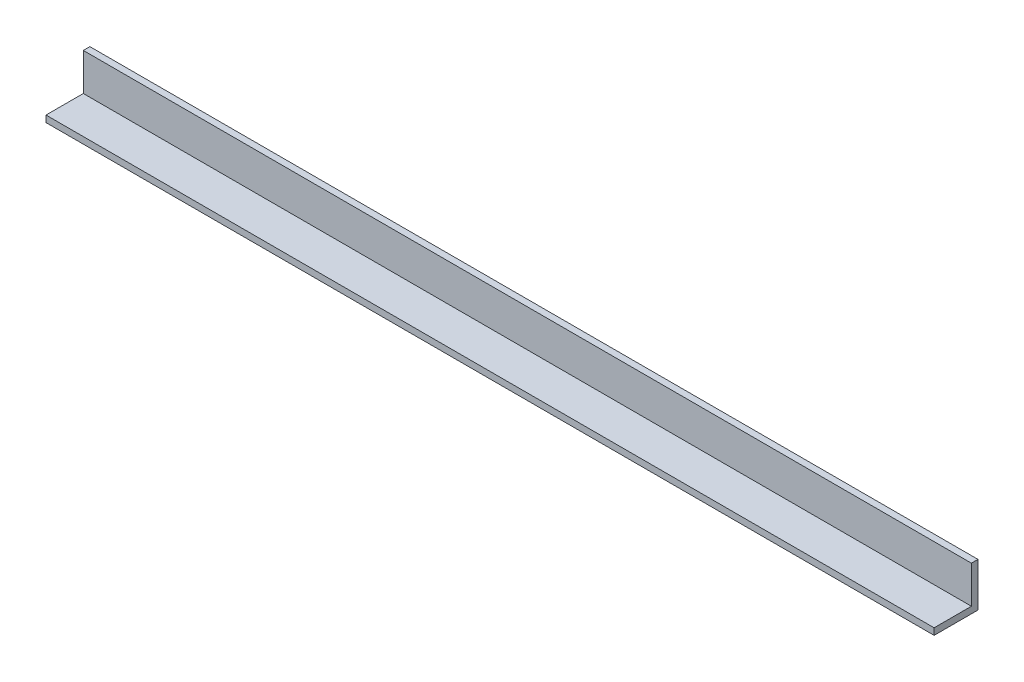
ISO-10303-21;
HEADER;
FILE_DESCRIPTION(('STEP AP214'),'2;1');
FILE_NAME('part.step','',(''),(''),'','','');
FILE_SCHEMA(('AUTOMOTIVE_DESIGN { 1 0 10303 214 1 1 1 1 }'));
ENDSEC;
DATA;
#1=APPLICATION_CONTEXT('core data for automotive mechanical design processes');
#2=APPLICATION_PROTOCOL_DEFINITION('international standard','automotive_design',2000,#1);
#3=PRODUCT_CONTEXT('',#1,'mechanical');
#4=PRODUCT('Part','Part','',(#3));
#5=PRODUCT_RELATED_PRODUCT_CATEGORY('part','',(#4));
#6=PRODUCT_DEFINITION_FORMATION('','',#4);
#7=PRODUCT_DEFINITION_CONTEXT('part definition',#1,'design');
#8=PRODUCT_DEFINITION('design','',#6,#7);
#9=PRODUCT_DEFINITION_SHAPE('','',#8);
#10=(LENGTH_UNIT() NAMED_UNIT(*) SI_UNIT(.MILLI.,.METRE.));
#11=(NAMED_UNIT(*) PLANE_ANGLE_UNIT() SI_UNIT($,.RADIAN.));
#12=(NAMED_UNIT(*) SI_UNIT($,.STERADIAN.) SOLID_ANGLE_UNIT());
#13=UNCERTAINTY_MEASURE_WITH_UNIT(LENGTH_MEASURE(1.E-05),#10,'distance_accuracy_value','');
#14=(GEOMETRIC_REPRESENTATION_CONTEXT(3) GLOBAL_UNCERTAINTY_ASSIGNED_CONTEXT((#13)) GLOBAL_UNIT_ASSIGNED_CONTEXT((#10,
#11,#12)) REPRESENTATION_CONTEXT('',''));
#15=CARTESIAN_POINT('',(0.,0.,0.));
#16=DIRECTION('',(0.,0.,1.));
#17=DIRECTION('',(1.,0.,0.));
#18=AXIS2_PLACEMENT_3D('',#15,#16,#17);
#19=CARTESIAN_POINT('',(0.,0.,80.));
#20=DIRECTION('',(1.,0.,0.));
#21=DIRECTION('',(0.,0.,-1.));
#22=AXIS2_PLACEMENT_3D('',#19,#20,#21);
#23=PLANE('',#22);
#24=DIRECTION('',(0.,0.,1.));
#25=VECTOR('',#24,1.);
#26=CARTESIAN_POINT('',(0.,12.,12.));
#27=LINE('',#26,#25);
#28=CARTESIAN_POINT('',(0.,12.,12.));
#29=VERTEX_POINT('',#28);
#30=CARTESIAN_POINT('',(0.,12.,80.));
#31=VERTEX_POINT('',#30);
#32=EDGE_CURVE('E46',#29,#31,#27,.T.);
#33=ORIENTED_EDGE('',*,*,#32,.F.);
#34=DIRECTION('',(0.,-1.,0.));
#35=VECTOR('',#34,1.);
#36=CARTESIAN_POINT('',(0.,80.,12.));
#37=LINE('',#36,#35);
#38=CARTESIAN_POINT('',(0.,80.,12.));
#39=VERTEX_POINT('',#38);
#40=EDGE_CURVE('E82',#39,#29,#37,.T.);
#41=ORIENTED_EDGE('',*,*,#40,.F.);
#42=DIRECTION('',(0.,0.,-1.));
#43=VECTOR('',#42,1.);
#44=CARTESIAN_POINT('',(0.,80.,80.));
#45=LINE('',#44,#43);
#46=CARTESIAN_POINT('',(0.,80.,0.));
#47=VERTEX_POINT('',#46);
#48=EDGE_CURVE('E75',#39,#47,#45,.T.);
#49=ORIENTED_EDGE('',*,*,#48,.T.);
#50=DIRECTION('',(0.,-1.,0.));
#51=VECTOR('',#50,1.);
#52=CARTESIAN_POINT('',(0.,0.,0.));
#53=LINE('',#52,#51);
#54=CARTESIAN_POINT('',(0.,0.,0.));
#55=VERTEX_POINT('',#54);
#56=EDGE_CURVE('E79',#47,#55,#53,.T.);
#57=ORIENTED_EDGE('',*,*,#56,.T.);
#58=DIRECTION('',(0.,0.,-1.));
#59=VECTOR('',#58,1.);
#60=CARTESIAN_POINT('',(0.,0.,80.));
#61=LINE('',#60,#59);
#62=CARTESIAN_POINT('',(0.,0.,80.));
#63=VERTEX_POINT('',#62);
#64=EDGE_CURVE('E11',#63,#55,#61,.T.);
#65=ORIENTED_EDGE('',*,*,#64,.F.);
#66=DIRECTION('',(0.,-1.,0.));
#67=VECTOR('',#66,1.);
#68=CARTESIAN_POINT('',(0.,0.,80.));
#69=LINE('',#68,#67);
#70=EDGE_CURVE('E95',#31,#63,#69,.T.);
#71=ORIENTED_EDGE('',*,*,#70,.F.);
#72=EDGE_LOOP('',(#33,#41,#49,#57,#65,#71));
#73=FACE_BOUND('',#72,.T.);
#74=ADVANCED_FACE('F32',(#73),#23,.F.);
#75=CARTESIAN_POINT('',(0.,0.,80.));
#76=DIRECTION('',(0.,1.,0.));
#77=DIRECTION('',(0.,0.,1.));
#78=AXIS2_PLACEMENT_3D('',#75,#76,#77);
#79=PLANE('',#78);
#80=DIRECTION('',(1.,0.,0.));
#81=VECTOR('',#80,1.);
#82=CARTESIAN_POINT('',(0.,0.,0.));
#83=LINE('',#82,#81);
#84=CARTESIAN_POINT('',(1619.,0.,0.));
#85=VERTEX_POINT('',#84);
#86=EDGE_CURVE('E99',#55,#85,#83,.T.);
#87=ORIENTED_EDGE('',*,*,#86,.T.);
#88=DIRECTION('',(0.,0.,-1.));
#89=VECTOR('',#88,1.);
#90=CARTESIAN_POINT('',(1619.,0.,80.));
#91=LINE('',#90,#89);
#92=CARTESIAN_POINT('',(1619.,0.,80.));
#93=VERTEX_POINT('',#92);
#94=EDGE_CURVE('E39',#93,#85,#91,.T.);
#95=ORIENTED_EDGE('',*,*,#94,.F.);
#96=DIRECTION('',(1.,0.,0.));
#97=VECTOR('',#96,1.);
#98=CARTESIAN_POINT('',(0.,0.,80.));
#99=LINE('',#98,#97);
#100=EDGE_CURVE('E55',#63,#93,#99,.T.);
#101=ORIENTED_EDGE('',*,*,#100,.F.);
#102=ORIENTED_EDGE('',*,*,#64,.T.);
#103=EDGE_LOOP('',(#87,#95,#101,#102));
#104=FACE_BOUND('',#103,.T.);
#105=ADVANCED_FACE('F116',(#104),#79,.F.);
#106=CARTESIAN_POINT('',(1619.,0.,80.));
#107=DIRECTION('',(-1.,0.,0.));
#108=DIRECTION('',(0.,0.,1.));
#109=AXIS2_PLACEMENT_3D('',#106,#107,#108);
#110=PLANE('',#109);
#111=DIRECTION('',(0.,0.,-1.));
#112=VECTOR('',#111,1.);
#113=CARTESIAN_POINT('',(1619.,80.,80.));
#114=LINE('',#113,#112);
#115=CARTESIAN_POINT('',(1619.,80.,12.));
#116=VERTEX_POINT('',#115);
#117=CARTESIAN_POINT('',(1619.,80.,0.));
#118=VERTEX_POINT('',#117);
#119=EDGE_CURVE('E85',#116,#118,#114,.T.);
#120=ORIENTED_EDGE('',*,*,#119,.F.);
#121=DIRECTION('',(0.,-1.,0.));
#122=VECTOR('',#121,1.);
#123=CARTESIAN_POINT('',(1619.,80.,12.));
#124=LINE('',#123,#122);
#125=CARTESIAN_POINT('',(1619.,12.,12.));
#126=VERTEX_POINT('',#125);
#127=EDGE_CURVE('E126',#116,#126,#124,.T.);
#128=ORIENTED_EDGE('',*,*,#127,.T.);
#129=DIRECTION('',(0.,0.,1.));
#130=VECTOR('',#129,1.);
#131=CARTESIAN_POINT('',(1619.,12.,12.));
#132=LINE('',#131,#130);
#133=CARTESIAN_POINT('',(1619.,12.,80.));
#134=VERTEX_POINT('',#133);
#135=EDGE_CURVE('E123',#126,#134,#132,.T.);
#136=ORIENTED_EDGE('',*,*,#135,.T.);
#137=DIRECTION('',(0.,1.,0.));
#138=VECTOR('',#137,1.);
#139=CARTESIAN_POINT('',(1619.,0.,80.));
#140=LINE('',#139,#138);
#141=EDGE_CURVE('E86',#93,#134,#140,.T.);
#142=ORIENTED_EDGE('',*,*,#141,.F.);
#143=ORIENTED_EDGE('',*,*,#94,.T.);
#144=DIRECTION('',(0.,1.,0.));
#145=VECTOR('',#144,1.);
#146=CARTESIAN_POINT('',(1619.,0.,0.));
#147=LINE('',#146,#145);
#148=EDGE_CURVE('E96',#85,#118,#147,.T.);
#149=ORIENTED_EDGE('',*,*,#148,.T.);
#150=EDGE_LOOP('',(#120,#128,#136,#142,#143,#149));
#151=FACE_BOUND('',#150,.T.);
#152=ADVANCED_FACE('F113',(#151),#110,.F.);
#153=CARTESIAN_POINT('',(0.,80.,80.));
#154=DIRECTION('',(0.,-1.,0.));
#155=DIRECTION('',(0.,0.,-1.));
#156=AXIS2_PLACEMENT_3D('',#153,#154,#155);
#157=PLANE('',#156);
#158=ORIENTED_EDGE('',*,*,#48,.F.);
#159=DIRECTION('',(-1.,0.,0.));
#160=VECTOR('',#159,1.);
#161=CARTESIAN_POINT('',(1619.,80.,12.));
#162=LINE('',#161,#160);
#163=EDGE_CURVE('E100',#116,#39,#162,.T.);
#164=ORIENTED_EDGE('',*,*,#163,.F.);
#165=ORIENTED_EDGE('',*,*,#119,.T.);
#166=DIRECTION('',(-1.,0.,0.));
#167=VECTOR('',#166,1.);
#168=CARTESIAN_POINT('',(0.,80.,0.));
#169=LINE('',#168,#167);
#170=EDGE_CURVE('E89',#118,#47,#169,.T.);
#171=ORIENTED_EDGE('',*,*,#170,.T.);
#172=EDGE_LOOP('',(#158,#164,#165,#171));
#173=FACE_BOUND('',#172,.T.);
#174=ADVANCED_FACE('F90',(#173),#157,.F.);
#175=CARTESIAN_POINT('',(0.,80.,80.));
#176=DIRECTION('',(0.,0.,-1.));
#177=DIRECTION('',(-1.,0.,0.));
#178=AXIS2_PLACEMENT_3D('',#175,#176,#177);
#179=PLANE('',#178);
#180=ORIENTED_EDGE('',*,*,#141,.T.);
#181=DIRECTION('',(-1.,0.,0.));
#182=VECTOR('',#181,1.);
#183=CARTESIAN_POINT('',(1619.,12.,80.));
#184=LINE('',#183,#182);
#185=EDGE_CURVE('E104',#134,#31,#184,.T.);
#186=ORIENTED_EDGE('',*,*,#185,.T.);
#187=ORIENTED_EDGE('',*,*,#70,.T.);
#188=ORIENTED_EDGE('',*,*,#100,.T.);
#189=EDGE_LOOP('',(#180,#186,#187,#188));
#190=FACE_BOUND('',#189,.T.);
#191=ADVANCED_FACE('F142',(#190),#179,.F.);
#192=CARTESIAN_POINT('',(0.,80.,0.));
#193=DIRECTION('',(0.,0.,-1.));
#194=DIRECTION('',(-1.,0.,0.));
#195=AXIS2_PLACEMENT_3D('',#192,#193,#194);
#196=PLANE('',#195);
#197=ORIENTED_EDGE('',*,*,#56,.F.);
#198=ORIENTED_EDGE('',*,*,#170,.F.);
#199=ORIENTED_EDGE('',*,*,#148,.F.);
#200=ORIENTED_EDGE('',*,*,#86,.F.);
#201=EDGE_LOOP('',(#197,#198,#199,#200));
#202=FACE_BOUND('',#201,.T.);
#203=ADVANCED_FACE('F98',(#202),#196,.T.);
#204=CARTESIAN_POINT('',(1619.,80.,12.));
#205=DIRECTION('',(0.,0.,-1.));
#206=DIRECTION('',(0.,1.,0.));
#207=AXIS2_PLACEMENT_3D('',#204,#205,#206);
#208=PLANE('',#207);
#209=ORIENTED_EDGE('',*,*,#40,.T.);
#210=DIRECTION('',(-1.,0.,0.));
#211=VECTOR('',#210,1.);
#212=CARTESIAN_POINT('',(1619.,12.,12.));
#213=LINE('',#212,#211);
#214=EDGE_CURVE('E121',#126,#29,#213,.T.);
#215=ORIENTED_EDGE('',*,*,#214,.F.);
#216=ORIENTED_EDGE('',*,*,#127,.F.);
#217=ORIENTED_EDGE('',*,*,#163,.T.);
#218=EDGE_LOOP('',(#209,#215,#216,#217));
#219=FACE_BOUND('',#218,.T.);
#220=ADVANCED_FACE('F137',(#219),#208,.F.);
#221=CARTESIAN_POINT('',(1619.,12.,12.));
#222=DIRECTION('',(0.,-1.,0.));
#223=DIRECTION('',(0.,0.,-1.));
#224=AXIS2_PLACEMENT_3D('',#221,#222,#223);
#225=PLANE('',#224);
#226=ORIENTED_EDGE('',*,*,#32,.T.);
#227=ORIENTED_EDGE('',*,*,#185,.F.);
#228=ORIENTED_EDGE('',*,*,#135,.F.);
#229=ORIENTED_EDGE('',*,*,#214,.T.);
#230=EDGE_LOOP('',(#226,#227,#228,#229));
#231=FACE_BOUND('',#230,.T.);
#232=ADVANCED_FACE('F141',(#231),#225,.F.);
#233=CLOSED_SHELL('',(#74,#105,#152,#174,#191,#203,#220,#232));
#234=MANIFOLD_SOLID_BREP('B2',#233);
#235=ADVANCED_BREP_SHAPE_REPRESENTATION('',(#18,#234),#14);
#236=SHAPE_DEFINITION_REPRESENTATION(#9,#235);
ENDSEC;
END-ISO-10303-21;
